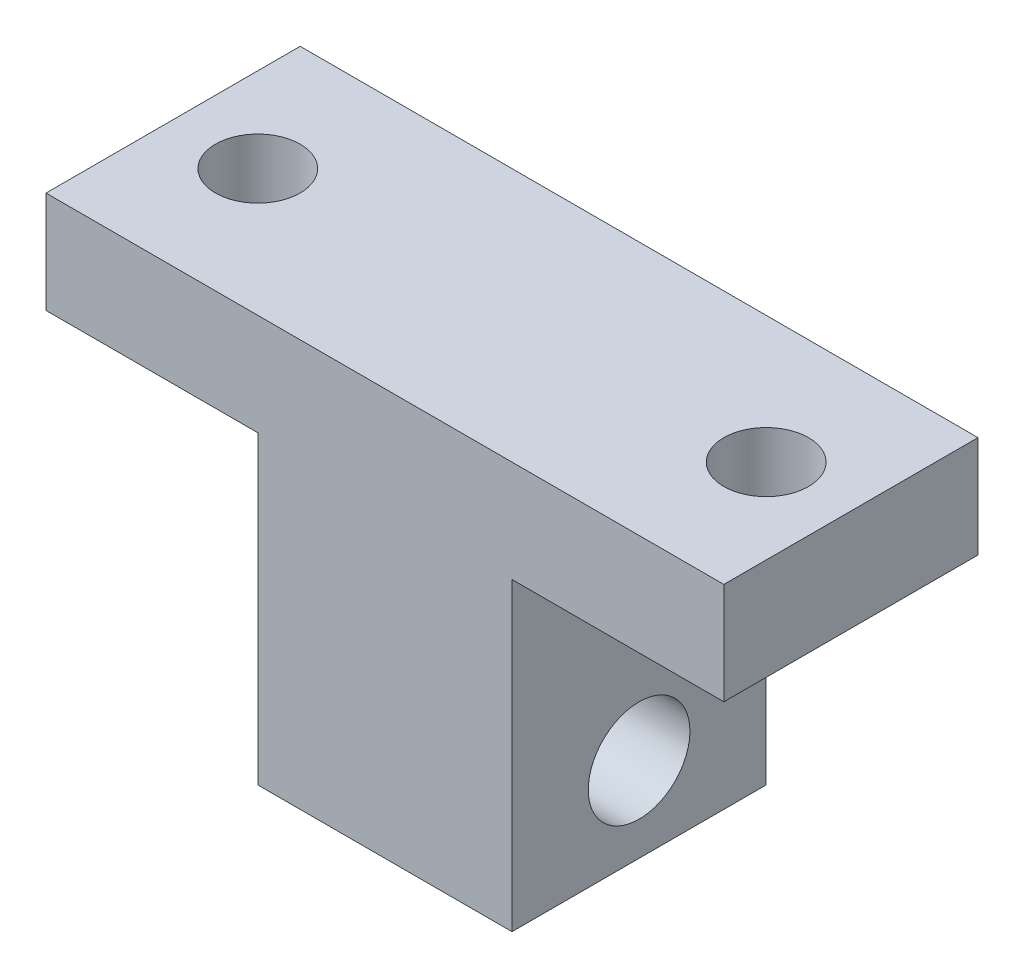
ISO-10303-21;
HEADER;
FILE_DESCRIPTION(('STEP AP214'),'2;1');
FILE_NAME('part.step','',(''),(''),'','','');
FILE_SCHEMA(('AUTOMOTIVE_DESIGN { 1 0 10303 214 1 1 1 1 }'));
ENDSEC;
DATA;
#1=APPLICATION_CONTEXT('core data for automotive mechanical design processes');
#2=APPLICATION_PROTOCOL_DEFINITION('international standard','automotive_design',2000,#1);
#3=PRODUCT_CONTEXT('',#1,'mechanical');
#4=PRODUCT('Part','Part','',(#3));
#5=PRODUCT_RELATED_PRODUCT_CATEGORY('part','',(#4));
#6=PRODUCT_DEFINITION_FORMATION('','',#4);
#7=PRODUCT_DEFINITION_CONTEXT('part definition',#1,'design');
#8=PRODUCT_DEFINITION('design','',#6,#7);
#9=PRODUCT_DEFINITION_SHAPE('','',#8);
#10=(LENGTH_UNIT() NAMED_UNIT(*) SI_UNIT(.MILLI.,.METRE.));
#11=(NAMED_UNIT(*) PLANE_ANGLE_UNIT() SI_UNIT($,.RADIAN.));
#12=(NAMED_UNIT(*) SI_UNIT($,.STERADIAN.) SOLID_ANGLE_UNIT());
#13=UNCERTAINTY_MEASURE_WITH_UNIT(LENGTH_MEASURE(1.E-05),#10,'distance_accuracy_value','');
#14=(GEOMETRIC_REPRESENTATION_CONTEXT(3) GLOBAL_UNCERTAINTY_ASSIGNED_CONTEXT((#13)) GLOBAL_UNIT_ASSIGNED_CONTEXT((#10,
#11,#12)) REPRESENTATION_CONTEXT('',''));
#15=CARTESIAN_POINT('',(0.,0.,0.));
#16=DIRECTION('',(0.,0.,1.));
#17=DIRECTION('',(1.,0.,0.));
#18=AXIS2_PLACEMENT_3D('',#15,#16,#17);
#19=CARTESIAN_POINT('',(-20.,-6.,15.));
#20=DIRECTION('',(1.,0.,0.));
#21=DIRECTION('',(0.,1.,0.));
#22=AXIS2_PLACEMENT_3D('',#19,#20,#21);
#23=PLANE('',#22);
#24=DIRECTION('',(0.,-1.,0.));
#25=VECTOR('',#24,1.);
#26=CARTESIAN_POINT('',(-20.,-6.,0.));
#27=LINE('',#26,#25);
#28=CARTESIAN_POINT('',(-20.,0.,0.));
#29=VERTEX_POINT('',#28);
#30=CARTESIAN_POINT('',(-20.,-6.,0.));
#31=VERTEX_POINT('',#30);
#32=EDGE_CURVE('E140',#29,#31,#27,.T.);
#33=ORIENTED_EDGE('',*,*,#32,.T.);
#34=DIRECTION('',(0.,0.,-1.));
#35=VECTOR('',#34,1.);
#36=CARTESIAN_POINT('',(-20.,-6.,15.));
#37=LINE('',#36,#35);
#38=CARTESIAN_POINT('',(-20.,-6.,15.));
#39=VERTEX_POINT('',#38);
#40=EDGE_CURVE('E11',#39,#31,#37,.T.);
#41=ORIENTED_EDGE('',*,*,#40,.F.);
#42=DIRECTION('',(0.,-1.,0.));
#43=VECTOR('',#42,1.);
#44=CARTESIAN_POINT('',(-20.,-6.,15.));
#45=LINE('',#44,#43);
#46=CARTESIAN_POINT('',(-20.,0.,15.));
#47=VERTEX_POINT('',#46);
#48=EDGE_CURVE('E163',#47,#39,#45,.T.);
#49=ORIENTED_EDGE('',*,*,#48,.F.);
#50=DIRECTION('',(0.,0.,-1.));
#51=VECTOR('',#50,1.);
#52=CARTESIAN_POINT('',(-20.,0.,15.));
#53=LINE('',#52,#51);
#54=EDGE_CURVE('E136',#47,#29,#53,.T.);
#55=ORIENTED_EDGE('',*,*,#54,.T.);
#56=EDGE_LOOP('',(#33,#41,#49,#55));
#57=FACE_BOUND('',#56,.T.);
#58=ADVANCED_FACE('F39',(#57),#23,.F.);
#59=CARTESIAN_POINT('',(-7.5,-6.,15.));
#60=DIRECTION('',(0.,1.,0.));
#61=DIRECTION('',(-1.,0.,0.));
#62=AXIS2_PLACEMENT_3D('',#59,#60,#61);
#63=PLANE('',#62);
#64=CARTESIAN_POINT('',(-15.,-6.,7.5));
#65=DIRECTION('',(0.,1.,0.));
#66=DIRECTION('',(0.,0.,-1.));
#67=AXIS2_PLACEMENT_3D('',#64,#65,#66);
#68=CIRCLE('',#67,2.5);
#69=CARTESIAN_POINT('',(-15.,-6.,5.));
#70=VERTEX_POINT('',#69);
#71=EDGE_CURVE('E215',#70,#70,#68,.T.);
#72=ORIENTED_EDGE('',*,*,#71,.T.);
#73=EDGE_LOOP('',(#72));
#74=FACE_BOUND('',#73,.T.);
#75=DIRECTION('',(1.,0.,0.));
#76=VECTOR('',#75,1.);
#77=CARTESIAN_POINT('',(-7.5,-6.,0.));
#78=LINE('',#77,#76);
#79=CARTESIAN_POINT('',(-7.5,-6.,0.));
#80=VERTEX_POINT('',#79);
#81=EDGE_CURVE('E144',#31,#80,#78,.T.);
#82=ORIENTED_EDGE('',*,*,#81,.T.);
#83=DIRECTION('',(0.,0.,-1.));
#84=VECTOR('',#83,1.);
#85=CARTESIAN_POINT('',(-7.5,-6.,15.));
#86=LINE('',#85,#84);
#87=CARTESIAN_POINT('',(-7.5,-6.,15.));
#88=VERTEX_POINT('',#87);
#89=EDGE_CURVE('E48',#88,#80,#86,.T.);
#90=ORIENTED_EDGE('',*,*,#89,.F.);
#91=DIRECTION('',(1.,0.,0.));
#92=VECTOR('',#91,1.);
#93=CARTESIAN_POINT('',(-7.5,-6.,15.));
#94=LINE('',#93,#92);
#95=EDGE_CURVE('E99',#39,#88,#94,.T.);
#96=ORIENTED_EDGE('',*,*,#95,.F.);
#97=ORIENTED_EDGE('',*,*,#40,.T.);
#98=EDGE_LOOP('',(#82,#90,#96,#97));
#99=FACE_BOUND('',#98,.T.);
#100=ADVANCED_FACE('F244',(#74,#99),#63,.F.);
#101=CARTESIAN_POINT('',(-7.5,-24.,15.));
#102=DIRECTION('',(1.,0.,0.));
#103=DIRECTION('',(0.,1.,0.));
#104=AXIS2_PLACEMENT_3D('',#101,#102,#103);
#105=PLANE('',#104);
#106=CARTESIAN_POINT('',(-7.5,-19.,7.5));
#107=DIRECTION('',(1.,0.,0.));
#108=DIRECTION('',(0.,1.,0.));
#109=AXIS2_PLACEMENT_3D('',#106,#107,#108);
#110=CIRCLE('',#109,3.);
#111=CARTESIAN_POINT('',(-7.5,-16.,7.5));
#112=VERTEX_POINT('',#111);
#113=EDGE_CURVE('E219',#112,#112,#110,.T.);
#114=ORIENTED_EDGE('',*,*,#113,.T.);
#115=EDGE_LOOP('',(#114));
#116=FACE_BOUND('',#115,.T.);
#117=DIRECTION('',(0.,-1.,0.));
#118=VECTOR('',#117,1.);
#119=CARTESIAN_POINT('',(-7.5,-24.,0.));
#120=LINE('',#119,#118);
#121=CARTESIAN_POINT('',(-7.5,-24.,0.));
#122=VERTEX_POINT('',#121);
#123=EDGE_CURVE('E148',#80,#122,#120,.T.);
#124=ORIENTED_EDGE('',*,*,#123,.T.);
#125=DIRECTION('',(0.,0.,-1.));
#126=VECTOR('',#125,1.);
#127=CARTESIAN_POINT('',(-7.5,-24.,15.));
#128=LINE('',#127,#126);
#129=CARTESIAN_POINT('',(-7.5,-24.,15.));
#130=VERTEX_POINT('',#129);
#131=EDGE_CURVE('E174',#130,#122,#128,.T.);
#132=ORIENTED_EDGE('',*,*,#131,.F.);
#133=DIRECTION('',(0.,-1.,0.));
#134=VECTOR('',#133,1.);
#135=CARTESIAN_POINT('',(-7.5,-24.,15.));
#136=LINE('',#135,#134);
#137=EDGE_CURVE('E184',#88,#130,#136,.T.);
#138=ORIENTED_EDGE('',*,*,#137,.F.);
#139=ORIENTED_EDGE('',*,*,#89,.T.);
#140=EDGE_LOOP('',(#124,#132,#138,#139));
#141=FACE_BOUND('',#140,.T.);
#142=ADVANCED_FACE('F182',(#116,#141),#105,.F.);
#143=CARTESIAN_POINT('',(7.5,-24.,15.));
#144=DIRECTION('',(0.,1.,0.));
#145=DIRECTION('',(-1.,0.,0.));
#146=AXIS2_PLACEMENT_3D('',#143,#144,#145);
#147=PLANE('',#146);
#148=DIRECTION('',(1.,0.,0.));
#149=VECTOR('',#148,1.);
#150=CARTESIAN_POINT('',(7.5,-24.,0.));
#151=LINE('',#150,#149);
#152=CARTESIAN_POINT('',(7.5,-24.,0.));
#153=VERTEX_POINT('',#152);
#154=EDGE_CURVE('E151',#122,#153,#151,.T.);
#155=ORIENTED_EDGE('',*,*,#154,.T.);
#156=DIRECTION('',(0.,0.,-1.));
#157=VECTOR('',#156,1.);
#158=CARTESIAN_POINT('',(7.5,-24.,15.));
#159=LINE('',#158,#157);
#160=CARTESIAN_POINT('',(7.5,-24.,15.));
#161=VERTEX_POINT('',#160);
#162=EDGE_CURVE('E170',#161,#153,#159,.T.);
#163=ORIENTED_EDGE('',*,*,#162,.F.);
#164=DIRECTION('',(1.,0.,0.));
#165=VECTOR('',#164,1.);
#166=CARTESIAN_POINT('',(7.5,-24.,15.));
#167=LINE('',#166,#165);
#168=EDGE_CURVE('E197',#130,#161,#167,.T.);
#169=ORIENTED_EDGE('',*,*,#168,.F.);
#170=ORIENTED_EDGE('',*,*,#131,.T.);
#171=EDGE_LOOP('',(#155,#163,#169,#170));
#172=FACE_BOUND('',#171,.T.);
#173=ADVANCED_FACE('F192',(#172),#147,.F.);
#174=CARTESIAN_POINT('',(7.5,-6.,15.));
#175=DIRECTION('',(-1.,0.,0.));
#176=DIRECTION('',(0.,-1.,0.));
#177=AXIS2_PLACEMENT_3D('',#174,#175,#176);
#178=PLANE('',#177);
#179=CARTESIAN_POINT('',(7.5,-19.,7.5));
#180=DIRECTION('',(1.,0.,0.));
#181=DIRECTION('',(0.,1.,0.));
#182=AXIS2_PLACEMENT_3D('',#179,#180,#181);
#183=CIRCLE('',#182,3.);
#184=CARTESIAN_POINT('',(7.5,-16.,7.5));
#185=VERTEX_POINT('',#184);
#186=EDGE_CURVE('E226',#185,#185,#183,.T.);
#187=ORIENTED_EDGE('',*,*,#186,.F.);
#188=EDGE_LOOP('',(#187));
#189=FACE_BOUND('',#188,.T.);
#190=DIRECTION('',(0.,1.,0.));
#191=VECTOR('',#190,1.);
#192=CARTESIAN_POINT('',(7.5,-6.,0.));
#193=LINE('',#192,#191);
#194=CARTESIAN_POINT('',(7.5,-6.,0.));
#195=VERTEX_POINT('',#194);
#196=EDGE_CURVE('E154',#153,#195,#193,.T.);
#197=ORIENTED_EDGE('',*,*,#196,.T.);
#198=DIRECTION('',(0.,0.,-1.));
#199=VECTOR('',#198,1.);
#200=CARTESIAN_POINT('',(7.5,-6.,15.));
#201=LINE('',#200,#199);
#202=CARTESIAN_POINT('',(7.5,-6.,15.));
#203=VERTEX_POINT('',#202);
#204=EDGE_CURVE('E129',#203,#195,#201,.T.);
#205=ORIENTED_EDGE('',*,*,#204,.F.);
#206=DIRECTION('',(0.,1.,0.));
#207=VECTOR('',#206,1.);
#208=CARTESIAN_POINT('',(7.5,-6.,15.));
#209=LINE('',#208,#207);
#210=EDGE_CURVE('E118',#161,#203,#209,.T.);
#211=ORIENTED_EDGE('',*,*,#210,.F.);
#212=ORIENTED_EDGE('',*,*,#162,.T.);
#213=EDGE_LOOP('',(#197,#205,#211,#212));
#214=FACE_BOUND('',#213,.T.);
#215=ADVANCED_FACE('F195',(#189,#214),#178,.F.);
#216=CARTESIAN_POINT('',(20.,-5.99999999999999,15.));
#217=DIRECTION('',(0.,1.,0.));
#218=DIRECTION('',(-1.,0.,0.));
#219=AXIS2_PLACEMENT_3D('',#216,#217,#218);
#220=PLANE('',#219);
#221=CARTESIAN_POINT('',(15.,-6.,7.5));
#222=DIRECTION('',(0.,-1.,0.));
#223=DIRECTION('',(0.,0.,-1.));
#224=AXIS2_PLACEMENT_3D('',#221,#222,#223);
#225=CIRCLE('',#224,2.5);
#226=CARTESIAN_POINT('',(15.,-6.,5.));
#227=VERTEX_POINT('',#226);
#228=EDGE_CURVE('E207',#227,#227,#225,.T.);
#229=ORIENTED_EDGE('',*,*,#228,.F.);
#230=EDGE_LOOP('',(#229));
#231=FACE_BOUND('',#230,.T.);
#232=DIRECTION('',(1.,0.,0.));
#233=VECTOR('',#232,1.);
#234=CARTESIAN_POINT('',(20.,-5.99999999999999,0.));
#235=LINE('',#234,#233);
#236=CARTESIAN_POINT('',(20.,-5.99999999999999,0.));
#237=VERTEX_POINT('',#236);
#238=EDGE_CURVE('E127',#195,#237,#235,.T.);
#239=ORIENTED_EDGE('',*,*,#238,.T.);
#240=DIRECTION('',(0.,0.,-1.));
#241=VECTOR('',#240,1.);
#242=CARTESIAN_POINT('',(20.,-5.99999999999999,15.));
#243=LINE('',#242,#241);
#244=CARTESIAN_POINT('',(20.,-5.99999999999999,15.));
#245=VERTEX_POINT('',#244);
#246=EDGE_CURVE('E124',#245,#237,#243,.T.);
#247=ORIENTED_EDGE('',*,*,#246,.F.);
#248=DIRECTION('',(1.,0.,0.));
#249=VECTOR('',#248,1.);
#250=CARTESIAN_POINT('',(20.,-5.99999999999999,15.));
#251=LINE('',#250,#249);
#252=EDGE_CURVE('E112',#203,#245,#251,.T.);
#253=ORIENTED_EDGE('',*,*,#252,.F.);
#254=ORIENTED_EDGE('',*,*,#204,.T.);
#255=EDGE_LOOP('',(#239,#247,#253,#254));
#256=FACE_BOUND('',#255,.T.);
#257=ADVANCED_FACE('F125',(#231,#256),#220,.F.);
#258=CARTESIAN_POINT('',(20.,0.,15.));
#259=DIRECTION('',(-1.,0.,0.));
#260=DIRECTION('',(0.,-1.,0.));
#261=AXIS2_PLACEMENT_3D('',#258,#259,#260);
#262=PLANE('',#261);
#263=DIRECTION('',(0.,1.,0.));
#264=VECTOR('',#263,1.);
#265=CARTESIAN_POINT('',(20.,0.,0.));
#266=LINE('',#265,#264);
#267=CARTESIAN_POINT('',(20.,0.,0.));
#268=VERTEX_POINT('',#267);
#269=EDGE_CURVE('E85',#237,#268,#266,.T.);
#270=ORIENTED_EDGE('',*,*,#269,.T.);
#271=DIRECTION('',(0.,0.,-1.));
#272=VECTOR('',#271,1.);
#273=CARTESIAN_POINT('',(20.,0.,15.));
#274=LINE('',#273,#272);
#275=CARTESIAN_POINT('',(20.,0.,15.));
#276=VERTEX_POINT('',#275);
#277=EDGE_CURVE('E130',#276,#268,#274,.T.);
#278=ORIENTED_EDGE('',*,*,#277,.F.);
#279=DIRECTION('',(0.,1.,0.));
#280=VECTOR('',#279,1.);
#281=CARTESIAN_POINT('',(20.,0.,15.));
#282=LINE('',#281,#280);
#283=EDGE_CURVE('E116',#245,#276,#282,.T.);
#284=ORIENTED_EDGE('',*,*,#283,.F.);
#285=ORIENTED_EDGE('',*,*,#246,.T.);
#286=EDGE_LOOP('',(#270,#278,#284,#285));
#287=FACE_BOUND('',#286,.T.);
#288=ADVANCED_FACE('F132',(#287),#262,.F.);
#289=CARTESIAN_POINT('',(-20.,0.,15.));
#290=DIRECTION('',(0.,-1.,0.));
#291=DIRECTION('',(1.,0.,0.));
#292=AXIS2_PLACEMENT_3D('',#289,#290,#291);
#293=PLANE('',#292);
#294=CARTESIAN_POINT('',(-15.,0.,7.5));
#295=DIRECTION('',(0.,1.,0.));
#296=DIRECTION('',(0.,0.,-1.));
#297=AXIS2_PLACEMENT_3D('',#294,#295,#296);
#298=CIRCLE('',#297,2.5);
#299=CARTESIAN_POINT('',(-15.,0.,5.));
#300=VERTEX_POINT('',#299);
#301=EDGE_CURVE('E211',#300,#300,#298,.T.);
#302=ORIENTED_EDGE('',*,*,#301,.F.);
#303=EDGE_LOOP('',(#302));
#304=FACE_BOUND('',#303,.T.);
#305=CARTESIAN_POINT('',(15.,0.,7.5));
#306=DIRECTION('',(0.,-1.,0.));
#307=DIRECTION('',(0.,0.,-1.));
#308=AXIS2_PLACEMENT_3D('',#305,#306,#307);
#309=CIRCLE('',#308,2.5);
#310=CARTESIAN_POINT('',(15.,0.,5.));
#311=VERTEX_POINT('',#310);
#312=EDGE_CURVE('E145',#311,#311,#309,.T.);
#313=ORIENTED_EDGE('',*,*,#312,.T.);
#314=EDGE_LOOP('',(#313));
#315=FACE_BOUND('',#314,.T.);
#316=DIRECTION('',(-1.,0.,0.));
#317=VECTOR('',#316,1.);
#318=CARTESIAN_POINT('',(-20.,0.,0.));
#319=LINE('',#318,#317);
#320=EDGE_CURVE('E91',#268,#29,#319,.T.);
#321=ORIENTED_EDGE('',*,*,#320,.T.);
#322=ORIENTED_EDGE('',*,*,#54,.F.);
#323=DIRECTION('',(-1.,0.,0.));
#324=VECTOR('',#323,1.);
#325=CARTESIAN_POINT('',(-20.,0.,15.));
#326=LINE('',#325,#324);
#327=EDGE_CURVE('E56',#276,#47,#326,.T.);
#328=ORIENTED_EDGE('',*,*,#327,.F.);
#329=ORIENTED_EDGE('',*,*,#277,.T.);
#330=EDGE_LOOP('',(#321,#322,#328,#329));
#331=FACE_BOUND('',#330,.T.);
#332=ADVANCED_FACE('F252',(#304,#315,#331),#293,.F.);
#333=CARTESIAN_POINT('',(0.,0.,15.));
#334=DIRECTION('',(0.,0.,-1.));
#335=DIRECTION('',(-1.,0.,0.));
#336=AXIS2_PLACEMENT_3D('',#333,#334,#335);
#337=PLANE('',#336);
#338=ORIENTED_EDGE('',*,*,#48,.T.);
#339=ORIENTED_EDGE('',*,*,#95,.T.);
#340=ORIENTED_EDGE('',*,*,#137,.T.);
#341=ORIENTED_EDGE('',*,*,#168,.T.);
#342=ORIENTED_EDGE('',*,*,#210,.T.);
#343=ORIENTED_EDGE('',*,*,#252,.T.);
#344=ORIENTED_EDGE('',*,*,#283,.T.);
#345=ORIENTED_EDGE('',*,*,#327,.T.);
#346=EDGE_LOOP('',(#338,#339,#340,#341,#342,#343,#344,#345));
#347=FACE_BOUND('',#346,.T.);
#348=ADVANCED_FACE('F114',(#347),#337,.F.);
#349=CARTESIAN_POINT('',(0.,0.,0.));
#350=DIRECTION('',(0.,0.,-1.));
#351=DIRECTION('',(-1.,0.,0.));
#352=AXIS2_PLACEMENT_3D('',#349,#350,#351);
#353=PLANE('',#352);
#354=ORIENTED_EDGE('',*,*,#32,.F.);
#355=ORIENTED_EDGE('',*,*,#320,.F.);
#356=ORIENTED_EDGE('',*,*,#269,.F.);
#357=ORIENTED_EDGE('',*,*,#238,.F.);
#358=ORIENTED_EDGE('',*,*,#196,.F.);
#359=ORIENTED_EDGE('',*,*,#154,.F.);
#360=ORIENTED_EDGE('',*,*,#123,.F.);
#361=ORIENTED_EDGE('',*,*,#81,.F.);
#362=EDGE_LOOP('',(#354,#355,#356,#357,#358,#359,#360,#361));
#363=FACE_BOUND('',#362,.T.);
#364=ADVANCED_FACE('F188',(#363),#353,.T.);
#365=CARTESIAN_POINT('',(15.,0.,7.5));
#366=DIRECTION('',(0.,-1.,0.));
#367=DIRECTION('',(0.,0.,-1.));
#368=AXIS2_PLACEMENT_3D('',#365,#366,#367);
#369=CYLINDRICAL_SURFACE('',#368,2.5);
#370=ORIENTED_EDGE('',*,*,#312,.F.);
#371=EDGE_LOOP('',(#370));
#372=FACE_BOUND('',#371,.T.);
#373=ORIENTED_EDGE('',*,*,#228,.T.);
#374=EDGE_LOOP('',(#373));
#375=FACE_BOUND('',#374,.T.);
#376=ADVANCED_FACE('F266',(#372,#375),#369,.F.);
#377=CARTESIAN_POINT('',(-15.,0.,7.5));
#378=DIRECTION('',(0.,-1.,0.));
#379=DIRECTION('',(0.,0.,-1.));
#380=AXIS2_PLACEMENT_3D('',#377,#378,#379);
#381=CYLINDRICAL_SURFACE('',#380,2.5);
#382=ORIENTED_EDGE('',*,*,#301,.T.);
#383=EDGE_LOOP('',(#382));
#384=FACE_BOUND('',#383,.T.);
#385=ORIENTED_EDGE('',*,*,#71,.F.);
#386=EDGE_LOOP('',(#385));
#387=FACE_BOUND('',#386,.T.);
#388=ADVANCED_FACE('F270',(#384,#387),#381,.F.);
#389=CARTESIAN_POINT('',(-20.,-19.,7.5));
#390=DIRECTION('',(1.,0.,0.));
#391=DIRECTION('',(0.,1.,0.));
#392=AXIS2_PLACEMENT_3D('',#389,#390,#391);
#393=CYLINDRICAL_SURFACE('',#392,3.);
#394=ORIENTED_EDGE('',*,*,#186,.T.);
#395=EDGE_LOOP('',(#394));
#396=FACE_BOUND('',#395,.T.);
#397=ORIENTED_EDGE('',*,*,#113,.F.);
#398=EDGE_LOOP('',(#397));
#399=FACE_BOUND('',#398,.T.);
#400=ADVANCED_FACE('F231',(#396,#399),#393,.F.);
#401=CLOSED_SHELL('',(#58,#100,#142,#173,#215,#257,#288,#332,#348,#364,#376,#388,#400));
#402=MANIFOLD_SOLID_BREP('B2',#401);
#403=ADVANCED_BREP_SHAPE_REPRESENTATION('',(#18,#402),#14);
#404=SHAPE_DEFINITION_REPRESENTATION(#9,#403);
ENDSEC;
END-ISO-10303-21;
